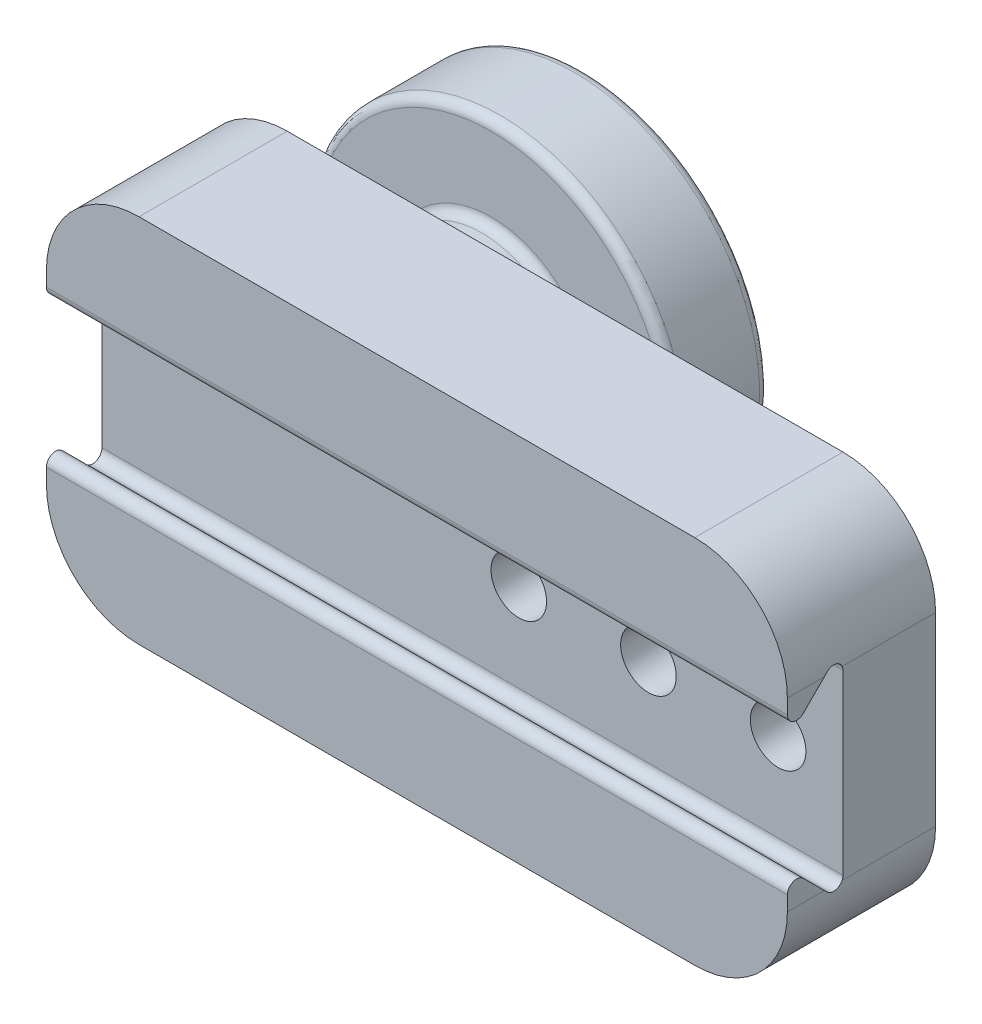
ISO-10303-21;
HEADER;
FILE_DESCRIPTION(('STEP AP214'),'2;1');
FILE_NAME('part.step','',(''),(''),'','','');
FILE_SCHEMA(('AUTOMOTIVE_DESIGN { 1 0 10303 214 1 1 1 1 }'));
ENDSEC;
DATA;
#1=APPLICATION_CONTEXT('core data for automotive mechanical design processes');
#2=APPLICATION_PROTOCOL_DEFINITION('international standard','automotive_design',2000,#1);
#3=PRODUCT_CONTEXT('',#1,'mechanical');
#4=PRODUCT('Part','Part','',(#3));
#5=PRODUCT_RELATED_PRODUCT_CATEGORY('part','',(#4));
#6=PRODUCT_DEFINITION_FORMATION('','',#4);
#7=PRODUCT_DEFINITION_CONTEXT('part definition',#1,'design');
#8=PRODUCT_DEFINITION('design','',#6,#7);
#9=PRODUCT_DEFINITION_SHAPE('','',#8);
#10=(LENGTH_UNIT() NAMED_UNIT(*) SI_UNIT(.MILLI.,.METRE.));
#11=(NAMED_UNIT(*) PLANE_ANGLE_UNIT() SI_UNIT($,.RADIAN.));
#12=(NAMED_UNIT(*) SI_UNIT($,.STERADIAN.) SOLID_ANGLE_UNIT());
#13=UNCERTAINTY_MEASURE_WITH_UNIT(LENGTH_MEASURE(1.E-05),#10,'distance_accuracy_value','');
#14=(GEOMETRIC_REPRESENTATION_CONTEXT(3) GLOBAL_UNCERTAINTY_ASSIGNED_CONTEXT((#13)) GLOBAL_UNIT_ASSIGNED_CONTEXT((#10,
#11,#12)) REPRESENTATION_CONTEXT('',''));
#15=CARTESIAN_POINT('',(0.,0.,0.));
#16=DIRECTION('',(0.,0.,1.));
#17=DIRECTION('',(1.,0.,0.));
#18=AXIS2_PLACEMENT_3D('',#15,#16,#17);
#19=CARTESIAN_POINT('',(-10.,10.,19.));
#20=DIRECTION('',(1.,0.,0.));
#21=DIRECTION('',(0.,1.,0.));
#22=AXIS2_PLACEMENT_3D('',#19,#20,#21);
#23=PLANE('',#22);
#24=DIRECTION('',(0.,-1.,0.));
#25=VECTOR('',#24,1.);
#26=CARTESIAN_POINT('',(-10.,10.,11.));
#27=LINE('',#26,#25);
#28=CARTESIAN_POINT('',(-10.,5.,11.));
#29=VERTEX_POINT('',#28);
#30=CARTESIAN_POINT('',(-10.,-5.,11.));
#31=VERTEX_POINT('',#30);
#32=EDGE_CURVE('E424',#29,#31,#27,.T.);
#33=ORIENTED_EDGE('',*,*,#32,.T.);
#34=DIRECTION('',(0.,0.,-1.));
#35=VECTOR('',#34,1.);
#36=CARTESIAN_POINT('',(-10.,-5.,19.));
#37=LINE('',#36,#35);
#38=CARTESIAN_POINT('',(-10.,-5.,16.0449101394378));
#39=VERTEX_POINT('',#38);
#40=EDGE_CURVE('E384',#31,#39,#37,.F.);
#41=ORIENTED_EDGE('',*,*,#40,.T.);
#42=CARTESIAN_POINT('',(-10.,-4.79289321881345,16.5));
#43=DIRECTION('',(1.,0.,0.));
#44=DIRECTION('',(0.,1.,0.));
#45=AXIS2_PLACEMENT_3D('',#42,#43,#44);
#46=CIRCLE('',#45,0.5);
#47=CARTESIAN_POINT('',(-10.,-4.79289321881345,16.));
#48=VERTEX_POINT('',#47);
#49=EDGE_CURVE('E230',#39,#48,#46,.T.);
#50=ORIENTED_EDGE('',*,*,#49,.T.);
#51=DIRECTION('',(0.,1.,0.));
#52=VECTOR('',#51,1.);
#53=CARTESIAN_POINT('',(-10.,6.,16.));
#54=LINE('',#53,#52);
#55=CARTESIAN_POINT('',(-10.,4.79289321881345,16.));
#56=VERTEX_POINT('',#55);
#57=EDGE_CURVE('E374',#48,#56,#54,.T.);
#58=ORIENTED_EDGE('',*,*,#57,.T.);
#59=CARTESIAN_POINT('',(-10.,4.79289321881345,16.5));
#60=DIRECTION('',(1.,0.,0.));
#61=DIRECTION('',(0.,1.,0.));
#62=AXIS2_PLACEMENT_3D('',#59,#60,#61);
#63=CIRCLE('',#62,0.5);
#64=CARTESIAN_POINT('',(-10.,5.,16.0449101394378));
#65=VERTEX_POINT('',#64);
#66=EDGE_CURVE('E237',#56,#65,#63,.T.);
#67=ORIENTED_EDGE('',*,*,#66,.T.);
#68=DIRECTION('',(0.,0.,-1.));
#69=VECTOR('',#68,1.);
#70=CARTESIAN_POINT('',(-10.,5.,19.));
#71=LINE('',#70,#69);
#72=EDGE_CURVE('E392',#65,#29,#71,.T.);
#73=ORIENTED_EDGE('',*,*,#72,.T.);
#74=EDGE_LOOP('',(#33,#41,#50,#58,#67,#73));
#75=FACE_BOUND('',#74,.T.);
#76=ADVANCED_FACE('F40',(#75),#23,.F.);
#77=DIRECTION('',(0.,-1.,0.));
#78=VECTOR('',#77,1.);
#79=CARTESIAN_POINT('',(-10.,10.,19.));
#80=LINE('',#79,#78);
#81=CARTESIAN_POINT('',(-10.,5.,19.));
#82=VERTEX_POINT('',#81);
#83=CARTESIAN_POINT('',(-10.,4.20710678118655,19.));
#84=VERTEX_POINT('',#83);
#85=EDGE_CURVE('E431',#82,#84,#80,.T.);
#86=ORIENTED_EDGE('',*,*,#85,.F.);
#87=DIRECTION('',(0.,0.,-1.));
#88=VECTOR('',#87,1.);
#89=CARTESIAN_POINT('',(-10.,5.,19.));
#90=LINE('',#89,#88);
#91=CARTESIAN_POINT('',(-10.,5.,17.));
#92=VERTEX_POINT('',#91);
#93=EDGE_CURVE('E385',#82,#92,#90,.T.);
#94=ORIENTED_EDGE('',*,*,#93,.T.);
#95=DIRECTION('',(0.,-0.707106781186548,0.707106781186547));
#96=VECTOR('',#95,1.);
#97=CARTESIAN_POINT('',(-10.,3.,19.));
#98=LINE('',#97,#96);
#99=CARTESIAN_POINT('',(-10.,3.85355339059327,18.1464466094067));
#100=VERTEX_POINT('',#99);
#101=EDGE_CURVE('E590',#92,#100,#98,.T.);
#102=ORIENTED_EDGE('',*,*,#101,.T.);
#103=CARTESIAN_POINT('',(-10.,4.20710678118655,18.5));
#104=DIRECTION('',(1.,0.,0.));
#105=DIRECTION('',(0.,1.,0.));
#106=AXIS2_PLACEMENT_3D('',#103,#104,#105);
#107=CIRCLE('',#106,0.5);
#108=EDGE_CURVE('E471',#100,#84,#107,.F.);
#109=ORIENTED_EDGE('',*,*,#108,.T.);
#110=EDGE_LOOP('',(#86,#94,#102,#109));
#111=FACE_BOUND('',#110,.T.);
#112=ADVANCED_FACE('F343',(#111),#23,.F.);
#113=CARTESIAN_POINT('',(30.,-10.,19.));
#114=DIRECTION('',(-1.,0.,0.));
#115=DIRECTION('',(0.,0.,1.));
#116=AXIS2_PLACEMENT_3D('',#113,#114,#115);
#117=PLANE('',#116);
#118=DIRECTION('',(0.,1.,0.));
#119=VECTOR('',#118,1.);
#120=CARTESIAN_POINT('',(30.,-10.,19.));
#121=LINE('',#120,#119);
#122=CARTESIAN_POINT('',(30.,-5.,19.));
#123=VERTEX_POINT('',#122);
#124=CARTESIAN_POINT('',(30.,-4.20710678118654,19.));
#125=VERTEX_POINT('',#124);
#126=EDGE_CURVE('E417',#123,#125,#121,.T.);
#127=ORIENTED_EDGE('',*,*,#126,.F.);
#128=DIRECTION('',(0.,0.,-1.));
#129=VECTOR('',#128,1.);
#130=CARTESIAN_POINT('',(30.,-5.,19.));
#131=LINE('',#130,#129);
#132=CARTESIAN_POINT('',(30.,-5.,17.));
#133=VERTEX_POINT('',#132);
#134=EDGE_CURVE('E201',#123,#133,#131,.T.);
#135=ORIENTED_EDGE('',*,*,#134,.T.);
#136=DIRECTION('',(0.,-0.707106781186548,-0.707106781186547));
#137=VECTOR('',#136,1.);
#138=CARTESIAN_POINT('',(30.,-6.5,15.5));
#139=LINE('',#138,#137);
#140=CARTESIAN_POINT('',(30.,-3.85355339059327,18.1464466094067));
#141=VERTEX_POINT('',#140);
#142=EDGE_CURVE('E184',#141,#133,#139,.T.);
#143=ORIENTED_EDGE('',*,*,#142,.F.);
#144=CARTESIAN_POINT('',(30.,-4.20710678118654,18.5));
#145=DIRECTION('',(-1.,0.,0.));
#146=DIRECTION('',(0.,0.,1.));
#147=AXIS2_PLACEMENT_3D('',#144,#145,#146);
#148=CIRCLE('',#147,0.5);
#149=EDGE_CURVE('E198',#141,#125,#148,.F.);
#150=ORIENTED_EDGE('',*,*,#149,.T.);
#151=EDGE_LOOP('',(#127,#135,#143,#150));
#152=FACE_BOUND('',#151,.T.);
#153=ADVANCED_FACE('F197',(#152),#117,.F.);
#154=CARTESIAN_POINT('',(30.,-4.79289321881345,16.5));
#155=DIRECTION('',(-1.,0.,0.));
#156=DIRECTION('',(0.,0.,1.));
#157=AXIS2_PLACEMENT_3D('',#154,#155,#156);
#158=CIRCLE('',#157,0.5);
#159=CARTESIAN_POINT('',(30.,-4.79289321881345,16.));
#160=VERTEX_POINT('',#159);
#161=CARTESIAN_POINT('',(30.,-5.,16.0449101394378));
#162=VERTEX_POINT('',#161);
#163=EDGE_CURVE('E233',#160,#162,#158,.T.);
#164=ORIENTED_EDGE('',*,*,#163,.T.);
#165=DIRECTION('',(0.,0.,-1.));
#166=VECTOR('',#165,1.);
#167=CARTESIAN_POINT('',(30.,-5.,19.));
#168=LINE('',#167,#166);
#169=CARTESIAN_POINT('',(30.,-5.,11.));
#170=VERTEX_POINT('',#169);
#171=EDGE_CURVE('E250',#162,#170,#168,.T.);
#172=ORIENTED_EDGE('',*,*,#171,.T.);
#173=DIRECTION('',(0.,1.,0.));
#174=VECTOR('',#173,1.);
#175=CARTESIAN_POINT('',(30.,-10.,11.));
#176=LINE('',#175,#174);
#177=CARTESIAN_POINT('',(30.,5.,11.));
#178=VERTEX_POINT('',#177);
#179=EDGE_CURVE('E439',#170,#178,#176,.T.);
#180=ORIENTED_EDGE('',*,*,#179,.T.);
#181=DIRECTION('',(0.,0.,-1.));
#182=VECTOR('',#181,1.);
#183=CARTESIAN_POINT('',(30.,5.,19.));
#184=LINE('',#183,#182);
#185=CARTESIAN_POINT('',(30.,5.,16.0449101394378));
#186=VERTEX_POINT('',#185);
#187=EDGE_CURVE('E247',#178,#186,#184,.F.);
#188=ORIENTED_EDGE('',*,*,#187,.T.);
#189=CARTESIAN_POINT('',(30.,4.79289321881345,16.5));
#190=DIRECTION('',(-1.,0.,0.));
#191=DIRECTION('',(0.,0.,1.));
#192=AXIS2_PLACEMENT_3D('',#189,#190,#191);
#193=CIRCLE('',#192,0.5);
#194=CARTESIAN_POINT('',(30.,4.79289321881345,16.));
#195=VERTEX_POINT('',#194);
#196=EDGE_CURVE('E241',#186,#195,#193,.T.);
#197=ORIENTED_EDGE('',*,*,#196,.T.);
#198=DIRECTION('',(0.,1.,0.));
#199=VECTOR('',#198,1.);
#200=CARTESIAN_POINT('',(30.,-10.,16.));
#201=LINE('',#200,#199);
#202=EDGE_CURVE('E203',#160,#195,#201,.T.);
#203=ORIENTED_EDGE('',*,*,#202,.F.);
#204=EDGE_LOOP('',(#164,#172,#180,#188,#197,#203));
#205=FACE_BOUND('',#204,.T.);
#206=ADVANCED_FACE('F368',(#205),#117,.F.);
#207=CARTESIAN_POINT('',(12.5,0.,32.));
#208=DIRECTION('',(0.,0.,-1.));
#209=DIRECTION('',(-1.,0.,0.));
#210=AXIS2_PLACEMENT_3D('',#207,#208,#209);
#211=CYLINDRICAL_SURFACE('',#210,1.5);
#212=CARTESIAN_POINT('',(12.5,0.,16.));
#213=DIRECTION('',(0.,0.,1.));
#214=DIRECTION('',(1.,0.,0.));
#215=AXIS2_PLACEMENT_3D('',#212,#213,#214);
#216=CIRCLE('',#215,1.5);
#217=CARTESIAN_POINT('',(14.,0.,16.));
#218=VERTEX_POINT('',#217);
#219=EDGE_CURVE('E434',#218,#218,#216,.F.);
#220=ORIENTED_EDGE('',*,*,#219,.F.);
#221=EDGE_LOOP('',(#220));
#222=FACE_BOUND('',#221,.T.);
#223=CARTESIAN_POINT('',(12.5,0.,11.));
#224=DIRECTION('',(0.,0.,1.));
#225=DIRECTION('',(1.,0.,0.));
#226=AXIS2_PLACEMENT_3D('',#223,#224,#225);
#227=CIRCLE('',#226,1.5);
#228=CARTESIAN_POINT('',(14.,0.,11.));
#229=VERTEX_POINT('',#228);
#230=EDGE_CURVE('E191',#229,#229,#227,.F.);
#231=ORIENTED_EDGE('',*,*,#230,.T.);
#232=EDGE_LOOP('',(#231));
#233=FACE_BOUND('',#232,.T.);
#234=ADVANCED_FACE('F287',(#222,#233),#211,.F.);
#235=DIRECTION('',(0.,-0.707106781186548,0.707106781186547));
#236=VECTOR('',#235,1.);
#237=CARTESIAN_POINT('',(30.,-3.5,25.5));
#238=LINE('',#237,#236);
#239=CARTESIAN_POINT('',(30.,5.,17.));
#240=VERTEX_POINT('',#239);
#241=CARTESIAN_POINT('',(30.,3.85355339059328,18.1464466094067));
#242=VERTEX_POINT('',#241);
#243=EDGE_CURVE('E204',#240,#242,#238,.T.);
#244=ORIENTED_EDGE('',*,*,#243,.F.);
#245=DIRECTION('',(0.,0.,-1.));
#246=VECTOR('',#245,1.);
#247=CARTESIAN_POINT('',(30.,5.,19.));
#248=LINE('',#247,#246);
#249=CARTESIAN_POINT('',(30.,5.,19.));
#250=VERTEX_POINT('',#249);
#251=EDGE_CURVE('E244',#240,#250,#248,.F.);
#252=ORIENTED_EDGE('',*,*,#251,.T.);
#253=CARTESIAN_POINT('',(30.,4.20710678118655,19.));
#254=VERTEX_POINT('',#253);
#255=EDGE_CURVE('E414',#254,#250,#121,.T.);
#256=ORIENTED_EDGE('',*,*,#255,.F.);
#257=CARTESIAN_POINT('',(30.,4.20710678118655,18.5));
#258=DIRECTION('',(-1.,0.,0.));
#259=DIRECTION('',(0.,0.,1.));
#260=AXIS2_PLACEMENT_3D('',#257,#258,#259);
#261=CIRCLE('',#260,0.5);
#262=EDGE_CURVE('E211',#254,#242,#261,.F.);
#263=ORIENTED_EDGE('',*,*,#262,.T.);
#264=EDGE_LOOP('',(#244,#252,#256,#263));
#265=FACE_BOUND('',#264,.T.);
#266=ADVANCED_FACE('F357',(#265),#117,.F.);
#267=DIRECTION('',(0.,-0.707106781186548,-0.707106781186547));
#268=VECTOR('',#267,1.);
#269=CARTESIAN_POINT('',(-10.,-6.,16.));
#270=LINE('',#269,#268);
#271=CARTESIAN_POINT('',(-10.,-3.85355339059327,18.1464466094067));
#272=VERTEX_POINT('',#271);
#273=CARTESIAN_POINT('',(-10.,-5.,17.));
#274=VERTEX_POINT('',#273);
#275=EDGE_CURVE('E186',#272,#274,#270,.T.);
#276=ORIENTED_EDGE('',*,*,#275,.T.);
#277=DIRECTION('',(0.,0.,-1.));
#278=VECTOR('',#277,1.);
#279=CARTESIAN_POINT('',(-10.,-5.,19.));
#280=LINE('',#279,#278);
#281=CARTESIAN_POINT('',(-10.,-5.,19.));
#282=VERTEX_POINT('',#281);
#283=EDGE_CURVE('E371',#274,#282,#280,.F.);
#284=ORIENTED_EDGE('',*,*,#283,.T.);
#285=CARTESIAN_POINT('',(-10.,-4.20710678118654,19.));
#286=VERTEX_POINT('',#285);
#287=EDGE_CURVE('E430',#286,#282,#80,.T.);
#288=ORIENTED_EDGE('',*,*,#287,.F.);
#289=CARTESIAN_POINT('',(-10.,-4.20710678118654,18.5));
#290=DIRECTION('',(1.,0.,0.));
#291=DIRECTION('',(0.,1.,0.));
#292=AXIS2_PLACEMENT_3D('',#289,#290,#291);
#293=CIRCLE('',#292,0.5);
#294=EDGE_CURVE('E219',#286,#272,#293,.F.);
#295=ORIENTED_EDGE('',*,*,#294,.T.);
#296=EDGE_LOOP('',(#276,#284,#288,#295));
#297=FACE_BOUND('',#296,.T.);
#298=ADVANCED_FACE('F346',(#297),#23,.F.);
#299=CARTESIAN_POINT('',(0.,0.,19.));
#300=DIRECTION('',(0.,0.,1.));
#301=DIRECTION('',(1.,0.,0.));
#302=AXIS2_PLACEMENT_3D('',#299,#300,#301);
#303=PLANE('',#302);
#304=DIRECTION('',(1.,0.,0.));
#305=VECTOR('',#304,1.);
#306=CARTESIAN_POINT('',(-10.,-10.,19.));
#307=LINE('',#306,#305);
#308=CARTESIAN_POINT('',(-5.,-10.,19.));
#309=VERTEX_POINT('',#308);
#310=CARTESIAN_POINT('',(25.,-10.,19.));
#311=VERTEX_POINT('',#310);
#312=EDGE_CURVE('E418',#309,#311,#307,.T.);
#313=ORIENTED_EDGE('',*,*,#312,.T.);
#314=CARTESIAN_POINT('',(25.,-5.,19.));
#315=DIRECTION('',(0.,0.,1.));
#316=DIRECTION('',(1.,0.,0.));
#317=AXIS2_PLACEMENT_3D('',#314,#315,#316);
#318=CIRCLE('',#317,5.);
#319=EDGE_CURVE('E478',#311,#123,#318,.T.);
#320=ORIENTED_EDGE('',*,*,#319,.T.);
#321=ORIENTED_EDGE('',*,*,#126,.T.);
#322=DIRECTION('',(-1.,0.,0.));
#323=VECTOR('',#322,1.);
#324=CARTESIAN_POINT('',(0.,-4.20710678118654,19.));
#325=LINE('',#324,#323);
#326=EDGE_CURVE('E208',#125,#286,#325,.T.);
#327=ORIENTED_EDGE('',*,*,#326,.T.);
#328=ORIENTED_EDGE('',*,*,#287,.T.);
#329=CARTESIAN_POINT('',(-5.,-5.,19.));
#330=DIRECTION('',(0.,0.,1.));
#331=DIRECTION('',(1.,0.,0.));
#332=AXIS2_PLACEMENT_3D('',#329,#330,#331);
#333=CIRCLE('',#332,5.);
#334=EDGE_CURVE('E382',#282,#309,#333,.T.);
#335=ORIENTED_EDGE('',*,*,#334,.T.);
#336=EDGE_LOOP('',(#313,#320,#321,#327,#328,#335));
#337=FACE_BOUND('',#336,.T.);
#338=ADVANCED_FACE('F356',(#337),#303,.T.);
#339=DIRECTION('',(-1.,0.,0.));
#340=VECTOR('',#339,1.);
#341=CARTESIAN_POINT('',(30.,10.,19.));
#342=LINE('',#341,#340);
#343=CARTESIAN_POINT('',(25.,10.,19.));
#344=VERTEX_POINT('',#343);
#345=CARTESIAN_POINT('',(-5.,10.,19.));
#346=VERTEX_POINT('',#345);
#347=EDGE_CURVE('E422',#344,#346,#342,.T.);
#348=ORIENTED_EDGE('',*,*,#347,.T.);
#349=CARTESIAN_POINT('',(-5.,5.,19.));
#350=DIRECTION('',(0.,0.,1.));
#351=DIRECTION('',(1.,0.,0.));
#352=AXIS2_PLACEMENT_3D('',#349,#350,#351);
#353=CIRCLE('',#352,5.);
#354=EDGE_CURVE('E533',#346,#82,#353,.T.);
#355=ORIENTED_EDGE('',*,*,#354,.T.);
#356=ORIENTED_EDGE('',*,*,#85,.T.);
#357=DIRECTION('',(1.,0.,0.));
#358=VECTOR('',#357,1.);
#359=CARTESIAN_POINT('',(0.,4.20710678118655,19.));
#360=LINE('',#359,#358);
#361=EDGE_CURVE('E226',#84,#254,#360,.T.);
#362=ORIENTED_EDGE('',*,*,#361,.T.);
#363=ORIENTED_EDGE('',*,*,#255,.T.);
#364=CARTESIAN_POINT('',(25.,5.,19.));
#365=DIRECTION('',(0.,0.,1.));
#366=DIRECTION('',(1.,0.,0.));
#367=AXIS2_PLACEMENT_3D('',#364,#365,#366);
#368=CIRCLE('',#367,5.);
#369=EDGE_CURVE('E63',#250,#344,#368,.T.);
#370=ORIENTED_EDGE('',*,*,#369,.T.);
#371=EDGE_LOOP('',(#348,#355,#356,#362,#363,#370));
#372=FACE_BOUND('',#371,.T.);
#373=ADVANCED_FACE('F363',(#372),#303,.T.);
#374=CARTESIAN_POINT('',(0.,0.,5.));
#375=DIRECTION('',(0.,0.,-1.));
#376=DIRECTION('',(-1.,0.,0.));
#377=AXIS2_PLACEMENT_3D('',#374,#375,#376);
#378=CYLINDRICAL_SURFACE('',#377,10.);
#379=CARTESIAN_POINT('',(0.,0.,0.5));
#380=DIRECTION('',(0.,0.,-1.));
#381=DIRECTION('',(-1.,0.,0.));
#382=AXIS2_PLACEMENT_3D('',#379,#380,#381);
#383=CIRCLE('',#382,10.);
#384=CARTESIAN_POINT('',(-10.,0.,0.5));
#385=VERTEX_POINT('',#384);
#386=EDGE_CURVE('E542',#385,#385,#383,.F.);
#387=ORIENTED_EDGE('',*,*,#386,.T.);
#388=EDGE_LOOP('',(#387));
#389=FACE_BOUND('',#388,.T.);
#390=CARTESIAN_POINT('',(0.,0.,4.5));
#391=DIRECTION('',(0.,0.,-1.));
#392=DIRECTION('',(-1.,0.,0.));
#393=AXIS2_PLACEMENT_3D('',#390,#391,#392);
#394=CIRCLE('',#393,10.);
#395=CARTESIAN_POINT('',(-10.,0.,4.5));
#396=VERTEX_POINT('',#395);
#397=EDGE_CURVE('E538',#396,#396,#394,.T.);
#398=ORIENTED_EDGE('',*,*,#397,.T.);
#399=EDGE_LOOP('',(#398));
#400=FACE_BOUND('',#399,.T.);
#401=ADVANCED_FACE('F765',(#389,#400),#378,.T.);
#402=CARTESIAN_POINT('',(0.,0.,5.));
#403=DIRECTION('',(0.,0.,-1.));
#404=DIRECTION('',(-1.,0.,0.));
#405=AXIS2_PLACEMENT_3D('',#402,#403,#404);
#406=PLANE('',#405);
#407=CARTESIAN_POINT('',(0.,0.,5.));
#408=DIRECTION('',(0.,0.,-1.));
#409=DIRECTION('',(-1.,0.,0.));
#410=AXIS2_PLACEMENT_3D('',#407,#408,#409);
#411=CIRCLE('',#410,9.5);
#412=CARTESIAN_POINT('',(-9.5,0.,5.));
#413=VERTEX_POINT('',#412);
#414=EDGE_CURVE('E554',#413,#413,#411,.F.);
#415=ORIENTED_EDGE('',*,*,#414,.T.);
#416=EDGE_LOOP('',(#415));
#417=FACE_BOUND('',#416,.T.);
#418=CARTESIAN_POINT('',(0.,0.,5.));
#419=DIRECTION('',(0.,0.,-1.));
#420=DIRECTION('',(-1.,0.,0.));
#421=AXIS2_PLACEMENT_3D('',#418,#419,#420);
#422=CIRCLE('',#421,5.5);
#423=CARTESIAN_POINT('',(-5.5,0.,5.));
#424=VERTEX_POINT('',#423);
#425=EDGE_CURVE('E550',#424,#424,#422,.T.);
#426=ORIENTED_EDGE('',*,*,#425,.T.);
#427=EDGE_LOOP('',(#426));
#428=FACE_BOUND('',#427,.T.);
#429=ADVANCED_FACE('F801',(#417,#428),#406,.F.);
#430=CARTESIAN_POINT('',(0.,0.,0.));
#431=DIRECTION('',(0.,0.,-1.));
#432=DIRECTION('',(-1.,0.,0.));
#433=AXIS2_PLACEMENT_3D('',#430,#431,#432);
#434=PLANE('',#433);
#435=CARTESIAN_POINT('',(0.,0.,0.));
#436=DIRECTION('',(0.,0.,-1.));
#437=DIRECTION('',(-1.,0.,0.));
#438=AXIS2_PLACEMENT_3D('',#435,#436,#437);
#439=CIRCLE('',#438,9.5);
#440=CARTESIAN_POINT('',(-9.5,0.,0.));
#441=VERTEX_POINT('',#440);
#442=EDGE_CURVE('E546',#441,#441,#439,.T.);
#443=ORIENTED_EDGE('',*,*,#442,.T.);
#444=EDGE_LOOP('',(#443));
#445=FACE_BOUND('',#444,.T.);
#446=ADVANCED_FACE('F568',(#445),#434,.T.);
#447=CARTESIAN_POINT('',(0.,0.,11.));
#448=DIRECTION('',(0.,0.,-1.));
#449=DIRECTION('',(-1.,0.,0.));
#450=AXIS2_PLACEMENT_3D('',#447,#448,#449);
#451=CYLINDRICAL_SURFACE('',#450,5.);
#452=CARTESIAN_POINT('',(0.,0.,5.5));
#453=DIRECTION('',(0.,0.,-1.));
#454=DIRECTION('',(-1.,0.,0.));
#455=AXIS2_PLACEMENT_3D('',#452,#453,#454);
#456=CIRCLE('',#455,5.);
#457=CARTESIAN_POINT('',(-5.,0.,5.5));
#458=VERTEX_POINT('',#457);
#459=EDGE_CURVE('E49',#458,#458,#456,.F.);
#460=ORIENTED_EDGE('',*,*,#459,.T.);
#461=EDGE_LOOP('',(#460));
#462=FACE_BOUND('',#461,.T.);
#463=CARTESIAN_POINT('',(0.,0.,10.5));
#464=DIRECTION('',(0.,0.,1.));
#465=DIRECTION('',(1.,0.,0.));
#466=AXIS2_PLACEMENT_3D('',#463,#464,#465);
#467=CIRCLE('',#466,5.);
#468=CARTESIAN_POINT('',(5.,0.,10.5));
#469=VERTEX_POINT('',#468);
#470=EDGE_CURVE('E558',#469,#469,#467,.F.);
#471=ORIENTED_EDGE('',*,*,#470,.T.);
#472=EDGE_LOOP('',(#471));
#473=FACE_BOUND('',#472,.T.);
#474=ADVANCED_FACE('F565',(#462,#473),#451,.T.);
#475=CARTESIAN_POINT('',(10.,-10.,19.));
#476=DIRECTION('',(0.,1.,0.));
#477=DIRECTION('',(0.,0.,1.));
#478=AXIS2_PLACEMENT_3D('',#475,#476,#477);
#479=PLANE('',#478);
#480=DIRECTION('',(1.,0.,0.));
#481=VECTOR('',#480,1.);
#482=CARTESIAN_POINT('',(10.,-10.,11.));
#483=LINE('',#482,#481);
#484=CARTESIAN_POINT('',(-5.,-10.,11.));
#485=VERTEX_POINT('',#484);
#486=CARTESIAN_POINT('',(25.,-10.,11.));
#487=VERTEX_POINT('',#486);
#488=EDGE_CURVE('E435',#485,#487,#483,.T.);
#489=ORIENTED_EDGE('',*,*,#488,.T.);
#490=DIRECTION('',(0.,0.,-1.));
#491=VECTOR('',#490,1.);
#492=CARTESIAN_POINT('',(25.,-10.,19.));
#493=LINE('',#492,#491);
#494=EDGE_CURVE('E517',#487,#311,#493,.F.);
#495=ORIENTED_EDGE('',*,*,#494,.T.);
#496=ORIENTED_EDGE('',*,*,#312,.F.);
#497=DIRECTION('',(0.,0.,-1.));
#498=VECTOR('',#497,1.);
#499=CARTESIAN_POINT('',(-5.,-10.,19.));
#500=LINE('',#499,#498);
#501=EDGE_CURVE('E514',#309,#485,#500,.T.);
#502=ORIENTED_EDGE('',*,*,#501,.T.);
#503=EDGE_LOOP('',(#489,#495,#496,#502));
#504=FACE_BOUND('',#503,.T.);
#505=ADVANCED_FACE('F525',(#504),#479,.F.);
#506=CARTESIAN_POINT('',(-10.,10.,19.));
#507=DIRECTION('',(0.,-1.,0.));
#508=DIRECTION('',(0.,0.,-1.));
#509=AXIS2_PLACEMENT_3D('',#506,#507,#508);
#510=PLANE('',#509);
#511=DIRECTION('',(-1.,0.,0.));
#512=VECTOR('',#511,1.);
#513=CARTESIAN_POINT('',(-10.,10.,11.));
#514=LINE('',#513,#512);
#515=CARTESIAN_POINT('',(25.,10.,11.));
#516=VERTEX_POINT('',#515);
#517=CARTESIAN_POINT('',(-5.,10.,11.));
#518=VERTEX_POINT('',#517);
#519=EDGE_CURVE('E443',#516,#518,#514,.T.);
#520=ORIENTED_EDGE('',*,*,#519,.T.);
#521=DIRECTION('',(0.,0.,-1.));
#522=VECTOR('',#521,1.);
#523=CARTESIAN_POINT('',(-5.,10.,19.));
#524=LINE('',#523,#522);
#525=EDGE_CURVE('E56',#518,#346,#524,.F.);
#526=ORIENTED_EDGE('',*,*,#525,.T.);
#527=ORIENTED_EDGE('',*,*,#347,.F.);
#528=DIRECTION('',(0.,0.,-1.));
#529=VECTOR('',#528,1.);
#530=CARTESIAN_POINT('',(25.,10.,19.));
#531=LINE('',#530,#529);
#532=EDGE_CURVE('E315',#344,#516,#531,.T.);
#533=ORIENTED_EDGE('',*,*,#532,.T.);
#534=EDGE_LOOP('',(#520,#526,#527,#533));
#535=FACE_BOUND('',#534,.T.);
#536=ADVANCED_FACE('F529',(#535),#510,.F.);
#537=CARTESIAN_POINT('',(0.,0.,11.));
#538=DIRECTION('',(0.,0.,1.));
#539=DIRECTION('',(1.,0.,0.));
#540=AXIS2_PLACEMENT_3D('',#537,#538,#539);
#541=PLANE('',#540);
#542=CARTESIAN_POINT('',(0.,0.,11.));
#543=DIRECTION('',(0.,0.,1.));
#544=DIRECTION('',(1.,0.,0.));
#545=AXIS2_PLACEMENT_3D('',#542,#543,#544);
#546=CIRCLE('',#545,5.5);
#547=CARTESIAN_POINT('',(5.5,0.,11.));
#548=VERTEX_POINT('',#547);
#549=EDGE_CURVE('E11',#548,#548,#546,.T.);
#550=ORIENTED_EDGE('',*,*,#549,.T.);
#551=EDGE_LOOP('',(#550));
#552=FACE_BOUND('',#551,.T.);
#553=CARTESIAN_POINT('',(19.5,0.,11.));
#554=DIRECTION('',(0.,0.,1.));
#555=DIRECTION('',(1.,0.,0.));
#556=AXIS2_PLACEMENT_3D('',#553,#554,#555);
#557=CIRCLE('',#556,1.5);
#558=CARTESIAN_POINT('',(21.,0.,11.));
#559=VERTEX_POINT('',#558);
#560=EDGE_CURVE('E452',#559,#559,#557,.F.);
#561=ORIENTED_EDGE('',*,*,#560,.F.);
#562=EDGE_LOOP('',(#561));
#563=FACE_BOUND('',#562,.T.);
#564=CARTESIAN_POINT('',(26.5,0.,11.));
#565=DIRECTION('',(0.,0.,1.));
#566=DIRECTION('',(1.,0.,0.));
#567=AXIS2_PLACEMENT_3D('',#564,#565,#566);
#568=CIRCLE('',#567,1.5);
#569=CARTESIAN_POINT('',(28.,0.,11.));
#570=VERTEX_POINT('',#569);
#571=EDGE_CURVE('E375',#570,#570,#568,.F.);
#572=ORIENTED_EDGE('',*,*,#571,.F.);
#573=EDGE_LOOP('',(#572));
#574=FACE_BOUND('',#573,.T.);
#575=ORIENTED_EDGE('',*,*,#179,.F.);
#576=CARTESIAN_POINT('',(25.,-5.,11.));
#577=DIRECTION('',(0.,0.,1.));
#578=DIRECTION('',(1.,0.,0.));
#579=AXIS2_PLACEMENT_3D('',#576,#577,#578);
#580=CIRCLE('',#579,5.);
#581=EDGE_CURVE('E509',#170,#487,#580,.F.);
#582=ORIENTED_EDGE('',*,*,#581,.T.);
#583=ORIENTED_EDGE('',*,*,#488,.F.);
#584=CARTESIAN_POINT('',(-5.,-5.,11.));
#585=DIRECTION('',(0.,0.,1.));
#586=DIRECTION('',(1.,0.,0.));
#587=AXIS2_PLACEMENT_3D('',#584,#585,#586);
#588=CIRCLE('',#587,5.);
#589=EDGE_CURVE('E489',#485,#31,#588,.F.);
#590=ORIENTED_EDGE('',*,*,#589,.T.);
#591=ORIENTED_EDGE('',*,*,#32,.F.);
#592=CARTESIAN_POINT('',(-5.,5.,11.));
#593=DIRECTION('',(0.,0.,1.));
#594=DIRECTION('',(1.,0.,0.));
#595=AXIS2_PLACEMENT_3D('',#592,#593,#594);
#596=CIRCLE('',#595,5.);
#597=EDGE_CURVE('E501',#29,#518,#596,.F.);
#598=ORIENTED_EDGE('',*,*,#597,.T.);
#599=ORIENTED_EDGE('',*,*,#519,.F.);
#600=CARTESIAN_POINT('',(25.,5.,11.));
#601=DIRECTION('',(0.,0.,1.));
#602=DIRECTION('',(1.,0.,0.));
#603=AXIS2_PLACEMENT_3D('',#600,#601,#602);
#604=CIRCLE('',#603,5.);
#605=EDGE_CURVE('E505',#516,#178,#604,.F.);
#606=ORIENTED_EDGE('',*,*,#605,.T.);
#607=EDGE_LOOP('',(#575,#582,#583,#590,#591,#598,#599,#606));
#608=FACE_BOUND('',#607,.T.);
#609=ORIENTED_EDGE('',*,*,#230,.F.);
#610=EDGE_LOOP('',(#609));
#611=FACE_BOUND('',#610,.T.);
#612=ADVANCED_FACE('F498',(#552,#563,#574,#608,#611),#541,.F.);
#613=CARTESIAN_POINT('',(32.,6.,16.));
#614=DIRECTION('',(0.,0.,1.));
#615=DIRECTION('',(1.,0.,0.));
#616=AXIS2_PLACEMENT_3D('',#613,#614,#615);
#617=PLANE('',#616);
#618=CARTESIAN_POINT('',(19.5,0.,16.));
#619=DIRECTION('',(0.,0.,1.));
#620=DIRECTION('',(1.,0.,0.));
#621=AXIS2_PLACEMENT_3D('',#618,#619,#620);
#622=CIRCLE('',#621,1.5);
#623=CARTESIAN_POINT('',(21.,0.,16.));
#624=VERTEX_POINT('',#623);
#625=EDGE_CURVE('E844',#624,#624,#622,.F.);
#626=ORIENTED_EDGE('',*,*,#625,.T.);
#627=EDGE_LOOP('',(#626));
#628=FACE_BOUND('',#627,.T.);
#629=CARTESIAN_POINT('',(26.5,0.,16.));
#630=DIRECTION('',(0.,0.,1.));
#631=DIRECTION('',(1.,0.,0.));
#632=AXIS2_PLACEMENT_3D('',#629,#630,#631);
#633=CIRCLE('',#632,1.5);
#634=CARTESIAN_POINT('',(28.,0.,16.));
#635=VERTEX_POINT('',#634);
#636=EDGE_CURVE('E448',#635,#635,#633,.F.);
#637=ORIENTED_EDGE('',*,*,#636,.T.);
#638=EDGE_LOOP('',(#637));
#639=FACE_BOUND('',#638,.T.);
#640=ORIENTED_EDGE('',*,*,#57,.F.);
#641=DIRECTION('',(-1.,0.,0.));
#642=VECTOR('',#641,1.);
#643=CARTESIAN_POINT('',(30.,-4.79289321881345,16.));
#644=LINE('',#643,#642);
#645=EDGE_CURVE('E466',#48,#160,#644,.F.);
#646=ORIENTED_EDGE('',*,*,#645,.T.);
#647=ORIENTED_EDGE('',*,*,#202,.T.);
#648=DIRECTION('',(-1.,0.,0.));
#649=VECTOR('',#648,1.);
#650=CARTESIAN_POINT('',(-10.,4.79289321881345,16.));
#651=LINE('',#650,#649);
#652=EDGE_CURVE('E462',#195,#56,#651,.T.);
#653=ORIENTED_EDGE('',*,*,#652,.T.);
#654=EDGE_LOOP('',(#640,#646,#647,#653));
#655=FACE_BOUND('',#654,.T.);
#656=ORIENTED_EDGE('',*,*,#219,.T.);
#657=EDGE_LOOP('',(#656));
#658=FACE_BOUND('',#657,.T.);
#659=ADVANCED_FACE('F576',(#628,#639,#655,#658),#617,.T.);
#660=CARTESIAN_POINT('',(32.,-6.,16.));
#661=DIRECTION('',(0.,0.707106781186547,-0.707106781186548));
#662=DIRECTION('',(0.,0.707106781186548,0.707106781186547));
#663=AXIS2_PLACEMENT_3D('',#660,#661,#662);
#664=PLANE('',#663);
#665=ORIENTED_EDGE('',*,*,#142,.T.);
#666=CARTESIAN_POINT('',(25.,-5.,17.));
#667=DIRECTION('',(0.,0.707106781186547,-0.707106781186548));
#668=DIRECTION('',(0.,-0.707106781186548,-0.707106781186547));
#669=AXIS2_PLACEMENT_3D('',#666,#667,#668);
#670=ELLIPSE('',#669,7.07106781186547,5.);
#671=CARTESIAN_POINT('',(29.9978548789049,-5.14644660940672,16.8535533905933));
#672=VERTEX_POINT('',#671);
#673=EDGE_CURVE('E258',#133,#672,#670,.T.);
#674=ORIENTED_EDGE('',*,*,#673,.T.);
#675=DIRECTION('',(-1.,0.,0.));
#676=VECTOR('',#675,1.);
#677=CARTESIAN_POINT('',(-10.,-5.14644660940672,16.8535533905933));
#678=LINE('',#677,#676);
#679=CARTESIAN_POINT('',(-9.99785487890488,-5.14644660940672,16.8535533905933));
#680=VERTEX_POINT('',#679);
#681=EDGE_CURVE('E190',#672,#680,#678,.T.);
#682=ORIENTED_EDGE('',*,*,#681,.T.);
#683=CARTESIAN_POINT('',(-5.,-5.,17.));
#684=DIRECTION('',(0.,0.707106781186547,-0.707106781186548));
#685=DIRECTION('',(0.,-0.707106781186548,-0.707106781186547));
#686=AXIS2_PLACEMENT_3D('',#683,#684,#685);
#687=ELLIPSE('',#686,7.07106781186547,5.);
#688=EDGE_CURVE('E255',#680,#274,#687,.T.);
#689=ORIENTED_EDGE('',*,*,#688,.T.);
#690=ORIENTED_EDGE('',*,*,#275,.F.);
#691=DIRECTION('',(-1.,0.,0.));
#692=VECTOR('',#691,1.);
#693=CARTESIAN_POINT('',(32.,-3.85355339059327,18.1464466094067));
#694=LINE('',#693,#692);
#695=EDGE_CURVE('E181',#272,#141,#694,.F.);
#696=ORIENTED_EDGE('',*,*,#695,.T.);
#697=EDGE_LOOP('',(#665,#674,#682,#689,#690,#696));
#698=FACE_BOUND('',#697,.T.);
#699=ADVANCED_FACE('F183',(#698),#664,.T.);
#700=CARTESIAN_POINT('',(32.,3.,19.));
#701=DIRECTION('',(0.,-0.707106781186547,-0.707106781186548));
#702=DIRECTION('',(0.,0.707106781186548,-0.707106781186547));
#703=AXIS2_PLACEMENT_3D('',#700,#701,#702);
#704=PLANE('',#703);
#705=ORIENTED_EDGE('',*,*,#101,.F.);
#706=CARTESIAN_POINT('',(-5.,5.,17.));
#707=DIRECTION('',(0.,-0.707106781186547,-0.707106781186548));
#708=DIRECTION('',(0.,0.707106781186548,-0.707106781186547));
#709=AXIS2_PLACEMENT_3D('',#706,#707,#708);
#710=ELLIPSE('',#709,7.07106781186547,5.);
#711=CARTESIAN_POINT('',(-9.99785487890488,5.14644660940673,16.8535533905933));
#712=VERTEX_POINT('',#711);
#713=EDGE_CURVE('E397',#92,#712,#710,.T.);
#714=ORIENTED_EDGE('',*,*,#713,.T.);
#715=DIRECTION('',(-1.,0.,0.));
#716=VECTOR('',#715,1.);
#717=CARTESIAN_POINT('',(30.,5.14644660940673,16.8535533905933));
#718=LINE('',#717,#716);
#719=CARTESIAN_POINT('',(29.9978548789049,5.14644660940673,16.8535533905933));
#720=VERTEX_POINT('',#719);
#721=EDGE_CURVE('E216',#712,#720,#718,.F.);
#722=ORIENTED_EDGE('',*,*,#721,.T.);
#723=CARTESIAN_POINT('',(25.,5.,17.));
#724=DIRECTION('',(0.,-0.707106781186547,-0.707106781186548));
#725=DIRECTION('',(0.,0.707106781186548,-0.707106781186547));
#726=AXIS2_PLACEMENT_3D('',#723,#724,#725);
#727=ELLIPSE('',#726,7.07106781186547,5.);
#728=EDGE_CURVE('E389',#720,#240,#727,.T.);
#729=ORIENTED_EDGE('',*,*,#728,.T.);
#730=ORIENTED_EDGE('',*,*,#243,.T.);
#731=DIRECTION('',(1.,0.,0.));
#732=VECTOR('',#731,1.);
#733=CARTESIAN_POINT('',(32.,3.85355339059328,18.1464466094067));
#734=LINE('',#733,#732);
#735=EDGE_CURVE('E210',#242,#100,#734,.F.);
#736=ORIENTED_EDGE('',*,*,#735,.T.);
#737=EDGE_LOOP('',(#705,#714,#722,#729,#730,#736));
#738=FACE_BOUND('',#737,.T.);
#739=ADVANCED_FACE('F409',(#738),#704,.T.);
#740=CARTESIAN_POINT('',(26.5,0.,32.));
#741=DIRECTION('',(0.,0.,-1.));
#742=DIRECTION('',(-1.,0.,0.));
#743=AXIS2_PLACEMENT_3D('',#740,#741,#742);
#744=CYLINDRICAL_SURFACE('',#743,1.5);
#745=ORIENTED_EDGE('',*,*,#636,.F.);
#746=EDGE_LOOP('',(#745));
#747=FACE_BOUND('',#746,.T.);
#748=ORIENTED_EDGE('',*,*,#571,.T.);
#749=EDGE_LOOP('',(#748));
#750=FACE_BOUND('',#749,.T.);
#751=ADVANCED_FACE('F706',(#747,#750),#744,.F.);
#752=CARTESIAN_POINT('',(19.5,0.,32.));
#753=DIRECTION('',(0.,0.,-1.));
#754=DIRECTION('',(-1.,0.,0.));
#755=AXIS2_PLACEMENT_3D('',#752,#753,#754);
#756=CYLINDRICAL_SURFACE('',#755,1.5);
#757=ORIENTED_EDGE('',*,*,#625,.F.);
#758=EDGE_LOOP('',(#757));
#759=FACE_BOUND('',#758,.T.);
#760=ORIENTED_EDGE('',*,*,#560,.T.);
#761=EDGE_LOOP('',(#760));
#762=FACE_BOUND('',#761,.T.);
#763=ADVANCED_FACE('F285',(#759,#762),#756,.F.);
#764=CARTESIAN_POINT('',(32.,-4.79289321881345,16.5));
#765=DIRECTION('',(1.,0.,0.));
#766=DIRECTION('',(0.,0.,-1.));
#767=AXIS2_PLACEMENT_3D('',#764,#765,#766);
#768=CYLINDRICAL_SURFACE('',#767,0.5);
#769=ORIENTED_EDGE('',*,*,#681,.F.);
#770=CARTESIAN_POINT('',(29.9978548789049,-5.14644660940672,16.8535533905933));
#771=CARTESIAN_POINT('',(29.9972699002105,-5.166352779612,16.8336804973206));
#772=CARTESIAN_POINT('',(29.9966192368007,-5.18454227632952,16.8121029856383));
#773=CARTESIAN_POINT('',(29.9953137506321,-5.21704852061166,16.7662249973141));
#774=CARTESIAN_POINT('',(29.9946589308167,-5.23136775081049,16.7419262804434));
#775=CARTESIAN_POINT('',(29.9934709797885,-5.25572658160098,16.6912527594211));
#776=CARTESIAN_POINT('',(29.9929379069039,-5.26576413285536,16.6648769682591));
#777=CARTESIAN_POINT('',(29.9920887067429,-5.28126743866931,16.6108181401868));
#778=CARTESIAN_POINT('',(29.9917725269747,-5.2867342994831,16.5831354213097));
#779=CARTESIAN_POINT('',(29.9914122895034,-5.2929388151013,16.5272696232771));
#780=CARTESIAN_POINT('',(29.9913679739386,-5.29368095130674,16.4990870436963));
#781=CARTESIAN_POINT('',(29.9915583630059,-5.29042670273497,16.4429927623489));
#782=CARTESIAN_POINT('',(29.9917931173529,-5.28642947366199,16.41508110974));
#783=CARTESIAN_POINT('',(29.9925007972567,-5.27381603284229,16.3603537021514));
#784=CARTESIAN_POINT('',(29.9929734931278,-5.26520427499555,16.3335369172309));
#785=CARTESIAN_POINT('',(29.9940735253942,-5.2436098856375,16.2817296392386));
#786=CARTESIAN_POINT('',(29.9947008548053,-5.23062745152541,16.2567390637492));
#787=CARTESIAN_POINT('',(29.9959953848369,-5.20063655742286,16.2092500007214));
#788=CARTESIAN_POINT('',(29.9966626484661,-5.18362160262705,16.1867556202874));
#789=CARTESIAN_POINT('',(29.9979015125447,-5.14605587660685,16.144943460419));
#790=CARTESIAN_POINT('',(29.9984731474542,-5.12550638450359,16.1256245367409));
#791=CARTESIAN_POINT('',(29.9992577897537,-5.08759934859566,16.0955743669502));
#792=CARTESIAN_POINT('',(29.9995263180147,-5.07094272189018,16.0839488246446));
#793=CARTESIAN_POINT('',(29.9998979318262,-5.03636371762297,16.0628121198485));
#794=CARTESIAN_POINT('',(30.0000012133843,-5.01844286601897,16.0532984639008));
#795=CARTESIAN_POINT('',(30.,-5.,16.0449101394378));
#796=B_SPLINE_CURVE_WITH_KNOTS('',3,(#770,#771,#772,#773,#774,#775,#776,#777,#778,#779,#780,
#781,#782,#783,#784,#785,#786,#787,#788,#789,#790,#791,#792,#793,#794,#795),.UNSPECIFIED.,.F.,
.F.,(4,2,2,2,2,2,2,2,2,2,2,2,4),(0.,0.0842903947885744,0.168526591358239,0.252803060729167,
0.337059126572195,0.421235263620361,0.505426398507158,0.589536418885426,0.673642640989764,
0.757885256926433,0.842097450024645,0.902897305676999,0.963624989907144),.UNSPECIFIED.);
#797=EDGE_CURVE('E270',#672,#162,#796,.T.);
#798=ORIENTED_EDGE('',*,*,#797,.T.);
#799=ORIENTED_EDGE('',*,*,#163,.F.);
#800=ORIENTED_EDGE('',*,*,#645,.F.);
#801=ORIENTED_EDGE('',*,*,#49,.F.);
#802=CARTESIAN_POINT('',(-10.,-5.,16.0449101394378));
#803=CARTESIAN_POINT('',(-10.0000041925935,-5.02559190722422,16.0565305537018));
#804=CARTESIAN_POINT('',(-9.99980340861944,-5.05017499197273,16.0703464894318));
#805=CARTESIAN_POINT('',(-9.9991183854643,-5.0966684800439,16.1018763576997));
#806=CARTESIAN_POINT('',(-9.99863436847538,-5.11858096215215,16.1195872279279));
#807=CARTESIAN_POINT('',(-9.9975087687807,-5.15912820732766,16.1584412112609));
#808=CARTESIAN_POINT('',(-9.99686712468518,-5.17776168848458,16.1795856605236));
#809=CARTESIAN_POINT('',(-9.99556480057955,-5.21121675489347,16.2246941013743));
#810=CARTESIAN_POINT('',(-9.99490412406205,-5.22603903464139,16.2486575781035));
#811=CARTESIAN_POINT('',(-9.99368842403266,-5.25147422311816,16.2987683615848));
#812=CARTESIAN_POINT('',(-9.9931335496631,-5.26208121231787,16.324918677415));
#813=CARTESIAN_POINT('',(-9.99223053097703,-5.27875534113221,16.3786369327403));
#814=CARTESIAN_POINT('',(-9.99188241985102,-5.28482175191506,16.4062050990632));
#815=CARTESIAN_POINT('',(-9.99145404209424,-5.29223378009438,16.4619404987549));
#816=CARTESIAN_POINT('',(-9.9913734857797,-5.29358450328527,16.490107050959));
#817=CARTESIAN_POINT('',(-9.99149328873456,-5.29154023777189,16.5462654017143));
#818=CARTESIAN_POINT('',(-9.99169362911153,-5.28814556823119,16.5742572118911));
#819=CARTESIAN_POINT('',(-9.99234025105105,-5.2767150166863,16.6292466313674));
#820=CARTESIAN_POINT('',(-9.99278632540647,-5.26868304466146,16.6562450578721));
#821=CARTESIAN_POINT('',(-9.99384595334744,-5.24820740970938,16.7085087089716));
#822=CARTESIAN_POINT('',(-9.99445945368289,-5.23576514910622,16.7337744814483));
#823=CARTESIAN_POINT('',(-9.99556426051016,-5.21082479163912,16.7752212341427));
#824=CARTESIAN_POINT('',(-9.99604269093224,-5.19928566839181,16.7919879417839));
#825=CARTESIAN_POINT('',(-9.99697753598691,-5.17427391493072,16.8239775354418));
#826=CARTESIAN_POINT('',(-9.99743397760257,-5.16080373951376,16.8392023402526));
#827=CARTESIAN_POINT('',(-9.99785487890487,-5.14644660940672,16.8535533905933));
#828=B_SPLINE_CURVE_WITH_KNOTS('',3,(#802,#803,#804,#805,#806,#807,#808,#809,#810,#811,#812,
#813,#814,#815,#816,#817,#818,#819,#820,#821,#822,#823,#824,#825,#826,#827),.UNSPECIFIED.,.F.,
.F.,(4,2,2,2,2,2,2,2,2,2,2,2,4),(0.,0.0842047196044699,0.168343470227315,0.252515041781845,
0.336671264289287,0.420945253204146,0.505232766474366,0.589428991168302,0.673619553301323,
0.757739232927933,0.841832189271669,0.902767027941259,0.963625080687193),.UNSPECIFIED.);
#829=EDGE_CURVE('E261',#39,#680,#828,.T.);
#830=ORIENTED_EDGE('',*,*,#829,.T.);
#831=EDGE_LOOP('',(#769,#798,#799,#800,#801,#830));
#832=FACE_BOUND('',#831,.T.);
#833=ADVANCED_FACE('F280',(#832),#768,.F.);
#834=CARTESIAN_POINT('',(0.,-4.20710678118654,18.5));
#835=DIRECTION('',(-1.,0.,0.));
#836=DIRECTION('',(0.,0.,1.));
#837=AXIS2_PLACEMENT_3D('',#834,#835,#836);
#838=CYLINDRICAL_SURFACE('',#837,0.5);
#839=ORIENTED_EDGE('',*,*,#149,.F.);
#840=ORIENTED_EDGE('',*,*,#695,.F.);
#841=ORIENTED_EDGE('',*,*,#294,.F.);
#842=ORIENTED_EDGE('',*,*,#326,.F.);
#843=EDGE_LOOP('',(#839,#840,#841,#842));
#844=FACE_BOUND('',#843,.T.);
#845=ADVANCED_FACE('F206',(#844),#838,.T.);
#846=CARTESIAN_POINT('',(32.,4.79289321881345,16.5));
#847=DIRECTION('',(1.,0.,0.));
#848=DIRECTION('',(0.,0.,-1.));
#849=AXIS2_PLACEMENT_3D('',#846,#847,#848);
#850=CYLINDRICAL_SURFACE('',#849,0.5);
#851=ORIENTED_EDGE('',*,*,#721,.F.);
#852=CARTESIAN_POINT('',(-9.99785487890488,5.14644660940673,16.8535533905933));
#853=CARTESIAN_POINT('',(-9.99726990021047,5.166352779612,16.8336804973206));
#854=CARTESIAN_POINT('',(-9.99661923680073,5.18454227632952,16.8121029856383));
#855=CARTESIAN_POINT('',(-9.99531375063214,5.21704852061166,16.7662249973141));
#856=CARTESIAN_POINT('',(-9.99465893081673,5.2313677508105,16.7419262804434));
#857=CARTESIAN_POINT('',(-9.99347097978847,5.25572658160098,16.691252759421));
#858=CARTESIAN_POINT('',(-9.99293790690386,5.26576413285536,16.6648769682591));
#859=CARTESIAN_POINT('',(-9.99208870674286,5.28126743866931,16.6108181401868));
#860=CARTESIAN_POINT('',(-9.99177252697469,5.2867342994831,16.5831354213097));
#861=CARTESIAN_POINT('',(-9.99141228950345,5.29293881510131,16.5272696232771));
#862=CARTESIAN_POINT('',(-9.99136797393864,5.29368095130674,16.4990870436962));
#863=CARTESIAN_POINT('',(-9.99155836300588,5.29042670273497,16.4429927623489));
#864=CARTESIAN_POINT('',(-9.99179311735294,5.28642947366199,16.41508110974));
#865=CARTESIAN_POINT('',(-9.99250079725666,5.27381603284229,16.3603537021514));
#866=CARTESIAN_POINT('',(-9.99297349312777,5.26520427499555,16.3335369172309));
#867=CARTESIAN_POINT('',(-9.99407352539424,5.2436098856375,16.2817296392386));
#868=CARTESIAN_POINT('',(-9.99470085480531,5.23062745152541,16.2567390637492));
#869=CARTESIAN_POINT('',(-9.99599538483687,5.20063655742286,16.2092500007214));
#870=CARTESIAN_POINT('',(-9.99666264846614,5.18362160262705,16.1867556202874));
#871=CARTESIAN_POINT('',(-9.99790151254472,5.14605587660685,16.144943460419));
#872=CARTESIAN_POINT('',(-9.99847314745419,5.12550638450359,16.1256245367409));
#873=CARTESIAN_POINT('',(-9.99925778975375,5.08759934859565,16.0955743669502));
#874=CARTESIAN_POINT('',(-9.99952631801469,5.07094272189018,16.0839488246446));
#875=CARTESIAN_POINT('',(-9.99989793182621,5.03636371762297,16.0628121198485));
#876=CARTESIAN_POINT('',(-10.0000012133843,5.01844286601897,16.0532984639008));
#877=CARTESIAN_POINT('',(-10.,5.,16.0449101394378));
#878=B_SPLINE_CURVE_WITH_KNOTS('',3,(#852,#853,#854,#855,#856,#857,#858,#859,#860,#861,#862,
#863,#864,#865,#866,#867,#868,#869,#870,#871,#872,#873,#874,#875,#876,#877),.UNSPECIFIED.,.F.,
.F.,(4,2,2,2,2,2,2,2,2,2,2,2,4),(0.,0.0842903947885738,0.168526591358242,0.252803060729169,
0.337059126572197,0.421235263620367,0.505426398507161,0.589536418885429,0.673642640989767,
0.75788525692644,0.842097450024649,0.902897305677002,0.963624989907144),.UNSPECIFIED.);
#879=EDGE_CURVE('E308',#712,#65,#878,.T.);
#880=ORIENTED_EDGE('',*,*,#879,.T.);
#881=ORIENTED_EDGE('',*,*,#66,.F.);
#882=ORIENTED_EDGE('',*,*,#652,.F.);
#883=ORIENTED_EDGE('',*,*,#196,.F.);
#884=CARTESIAN_POINT('',(30.,5.,16.0449101394378));
#885=CARTESIAN_POINT('',(30.0000041925935,5.02559190722422,16.0565305537018));
#886=CARTESIAN_POINT('',(29.9998034086194,5.05017499197273,16.0703464894318));
#887=CARTESIAN_POINT('',(29.9991183854643,5.0966684800439,16.1018763576997));
#888=CARTESIAN_POINT('',(29.9986343684754,5.11858096215215,16.1195872279279));
#889=CARTESIAN_POINT('',(29.9975087687807,5.15912820732767,16.1584412112609));
#890=CARTESIAN_POINT('',(29.9968671246852,5.17776168848458,16.1795856605236));
#891=CARTESIAN_POINT('',(29.9955648005796,5.21121675489347,16.2246941013743));
#892=CARTESIAN_POINT('',(29.9949041240621,5.22603903464139,16.2486575781035));
#893=CARTESIAN_POINT('',(29.9936884240327,5.25147422311816,16.2987683615848));
#894=CARTESIAN_POINT('',(29.9931335496631,5.26208121231788,16.324918677415));
#895=CARTESIAN_POINT('',(29.992230530977,5.27875534113221,16.3786369327403));
#896=CARTESIAN_POINT('',(29.991882419851,5.28482175191506,16.4062050990632));
#897=CARTESIAN_POINT('',(29.9914540420942,5.29223378009438,16.4619404987549));
#898=CARTESIAN_POINT('',(29.9913734857797,5.29358450328527,16.490107050959));
#899=CARTESIAN_POINT('',(29.9914932887346,5.29154023777189,16.5462654017143));
#900=CARTESIAN_POINT('',(29.9916936291115,5.28814556823119,16.5742572118911));
#901=CARTESIAN_POINT('',(29.992340251051,5.2767150166863,16.6292466313674));
#902=CARTESIAN_POINT('',(29.9927863254065,5.26868304466146,16.6562450578721));
#903=CARTESIAN_POINT('',(29.9938459533474,5.24820740970939,16.7085087089716));
#904=CARTESIAN_POINT('',(29.9944594536829,5.23576514910622,16.7337744814483));
#905=CARTESIAN_POINT('',(29.9955642605102,5.21082479163913,16.7752212341427));
#906=CARTESIAN_POINT('',(29.9960426909322,5.19928566839181,16.7919879417839));
#907=CARTESIAN_POINT('',(29.9969775359869,5.17427391493072,16.8239775354418));
#908=CARTESIAN_POINT('',(29.9974339776026,5.16080373951376,16.8392023402526));
#909=CARTESIAN_POINT('',(29.9978548789049,5.14644660940673,16.8535533905933));
#910=B_SPLINE_CURVE_WITH_KNOTS('',3,(#884,#885,#886,#887,#888,#889,#890,#891,#892,#893,#894,
#895,#896,#897,#898,#899,#900,#901,#902,#903,#904,#905,#906,#907,#908,#909),.UNSPECIFIED.,.F.,
.F.,(4,2,2,2,2,2,2,2,2,2,2,2,4),(0.,0.0842047196044682,0.168343470227315,0.252515041781849,
0.336671264289291,0.42094525320415,0.505232766474366,0.589428991168299,0.673619553301323,
0.757739232927934,0.841832189271673,0.902767027941262,0.963625080687196),.UNSPECIFIED.);
#911=EDGE_CURVE('E300',#186,#720,#910,.T.);
#912=ORIENTED_EDGE('',*,*,#911,.T.);
#913=EDGE_LOOP('',(#851,#880,#881,#882,#883,#912));
#914=FACE_BOUND('',#913,.T.);
#915=ADVANCED_FACE('F292',(#914),#850,.F.);
#916=CARTESIAN_POINT('',(0.,4.20710678118655,18.5));
#917=DIRECTION('',(1.,0.,0.));
#918=DIRECTION('',(0.,0.,-1.));
#919=AXIS2_PLACEMENT_3D('',#916,#917,#918);
#920=CYLINDRICAL_SURFACE('',#919,0.5);
#921=ORIENTED_EDGE('',*,*,#108,.F.);
#922=ORIENTED_EDGE('',*,*,#735,.F.);
#923=ORIENTED_EDGE('',*,*,#262,.F.);
#924=ORIENTED_EDGE('',*,*,#361,.F.);
#925=EDGE_LOOP('',(#921,#922,#923,#924));
#926=FACE_BOUND('',#925,.T.);
#927=ADVANCED_FACE('F296',(#926),#920,.T.);
#928=CARTESIAN_POINT('',(25.,-5.,19.));
#929=DIRECTION('',(0.,0.,-1.));
#930=DIRECTION('',(-1.,0.,0.));
#931=AXIS2_PLACEMENT_3D('',#928,#929,#930);
#932=CYLINDRICAL_SURFACE('',#931,5.);
#933=ORIENTED_EDGE('',*,*,#319,.F.);
#934=ORIENTED_EDGE('',*,*,#494,.F.);
#935=ORIENTED_EDGE('',*,*,#581,.F.);
#936=ORIENTED_EDGE('',*,*,#171,.F.);
#937=ORIENTED_EDGE('',*,*,#797,.F.);
#938=ORIENTED_EDGE('',*,*,#673,.F.);
#939=ORIENTED_EDGE('',*,*,#134,.F.);
#940=EDGE_LOOP('',(#933,#934,#935,#936,#937,#938,#939));
#941=FACE_BOUND('',#940,.T.);
#942=ADVANCED_FACE('F480',(#941),#932,.T.);
#943=CARTESIAN_POINT('',(-5.,-5.,19.));
#944=DIRECTION('',(0.,0.,-1.));
#945=DIRECTION('',(-1.,0.,0.));
#946=AXIS2_PLACEMENT_3D('',#943,#944,#945);
#947=CYLINDRICAL_SURFACE('',#946,5.);
#948=ORIENTED_EDGE('',*,*,#829,.F.);
#949=ORIENTED_EDGE('',*,*,#40,.F.);
#950=ORIENTED_EDGE('',*,*,#589,.F.);
#951=ORIENTED_EDGE('',*,*,#501,.F.);
#952=ORIENTED_EDGE('',*,*,#334,.F.);
#953=ORIENTED_EDGE('',*,*,#283,.F.);
#954=ORIENTED_EDGE('',*,*,#688,.F.);
#955=EDGE_LOOP('',(#948,#949,#950,#951,#952,#953,#954));
#956=FACE_BOUND('',#955,.T.);
#957=ADVANCED_FACE('F277',(#956),#947,.T.);
#958=CARTESIAN_POINT('',(-5.,5.,19.));
#959=DIRECTION('',(0.,0.,-1.));
#960=DIRECTION('',(-1.,0.,0.));
#961=AXIS2_PLACEMENT_3D('',#958,#959,#960);
#962=CYLINDRICAL_SURFACE('',#961,5.);
#963=ORIENTED_EDGE('',*,*,#354,.F.);
#964=ORIENTED_EDGE('',*,*,#525,.F.);
#965=ORIENTED_EDGE('',*,*,#597,.F.);
#966=ORIENTED_EDGE('',*,*,#72,.F.);
#967=ORIENTED_EDGE('',*,*,#879,.F.);
#968=ORIENTED_EDGE('',*,*,#713,.F.);
#969=ORIENTED_EDGE('',*,*,#93,.F.);
#970=EDGE_LOOP('',(#963,#964,#965,#966,#967,#968,#969));
#971=FACE_BOUND('',#970,.T.);
#972=ADVANCED_FACE('F317',(#971),#962,.T.);
#973=CARTESIAN_POINT('',(25.,5.,19.));
#974=DIRECTION('',(0.,0.,-1.));
#975=DIRECTION('',(-1.,0.,0.));
#976=AXIS2_PLACEMENT_3D('',#973,#974,#975);
#977=CYLINDRICAL_SURFACE('',#976,5.);
#978=ORIENTED_EDGE('',*,*,#911,.F.);
#979=ORIENTED_EDGE('',*,*,#187,.F.);
#980=ORIENTED_EDGE('',*,*,#605,.F.);
#981=ORIENTED_EDGE('',*,*,#532,.F.);
#982=ORIENTED_EDGE('',*,*,#369,.F.);
#983=ORIENTED_EDGE('',*,*,#251,.F.);
#984=ORIENTED_EDGE('',*,*,#728,.F.);
#985=EDGE_LOOP('',(#978,#979,#980,#981,#982,#983,#984));
#986=FACE_BOUND('',#985,.T.);
#987=ADVANCED_FACE('F320',(#986),#977,.T.);
#988=CARTESIAN_POINT('',(0.,0.,0.5));
#989=DIRECTION('',(0.,0.,-1.));
#990=DIRECTION('',(-1.,0.,0.));
#991=AXIS2_PLACEMENT_3D('',#988,#989,#990);
#992=TOROIDAL_SURFACE('',#991,9.5,0.5);
#993=ORIENTED_EDGE('',*,*,#442,.F.);
#994=EDGE_LOOP('',(#993));
#995=FACE_BOUND('',#994,.T.);
#996=ORIENTED_EDGE('',*,*,#386,.F.);
#997=EDGE_LOOP('',(#996));
#998=FACE_BOUND('',#997,.T.);
#999=ADVANCED_FACE('F325',(#995,#998),#992,.T.);
#1000=CARTESIAN_POINT('',(0.,0.,4.5));
#1001=DIRECTION('',(0.,0.,-1.));
#1002=DIRECTION('',(-1.,0.,0.));
#1003=AXIS2_PLACEMENT_3D('',#1000,#1001,#1002);
#1004=TOROIDAL_SURFACE('',#1003,9.5,0.5);
#1005=ORIENTED_EDGE('',*,*,#397,.F.);
#1006=EDGE_LOOP('',(#1005));
#1007=FACE_BOUND('',#1006,.T.);
#1008=ORIENTED_EDGE('',*,*,#414,.F.);
#1009=EDGE_LOOP('',(#1008));
#1010=FACE_BOUND('',#1009,.T.);
#1011=ADVANCED_FACE('F329',(#1007,#1010),#1004,.T.);
#1012=CARTESIAN_POINT('',(0.,0.,5.5));
#1013=DIRECTION('',(0.,0.,-1.));
#1014=DIRECTION('',(-1.,0.,0.));
#1015=AXIS2_PLACEMENT_3D('',#1012,#1013,#1014);
#1016=TOROIDAL_SURFACE('',#1015,5.5,0.5);
#1017=ORIENTED_EDGE('',*,*,#425,.F.);
#1018=EDGE_LOOP('',(#1017));
#1019=FACE_BOUND('',#1018,.T.);
#1020=ORIENTED_EDGE('',*,*,#459,.F.);
#1021=EDGE_LOOP('',(#1020));
#1022=FACE_BOUND('',#1021,.T.);
#1023=ADVANCED_FACE('F332',(#1019,#1022),#1016,.F.);
#1024=CARTESIAN_POINT('',(0.,0.,10.5));
#1025=DIRECTION('',(0.,0.,1.));
#1026=DIRECTION('',(1.,0.,0.));
#1027=AXIS2_PLACEMENT_3D('',#1024,#1025,#1026);
#1028=TOROIDAL_SURFACE('',#1027,5.5,0.5);
#1029=ORIENTED_EDGE('',*,*,#470,.F.);
#1030=EDGE_LOOP('',(#1029));
#1031=FACE_BOUND('',#1030,.T.);
#1032=ORIENTED_EDGE('',*,*,#549,.F.);
#1033=EDGE_LOOP('',(#1032));
#1034=FACE_BOUND('',#1033,.T.);
#1035=ADVANCED_FACE('F42',(#1031,#1034),#1028,.F.);
#1036=CLOSED_SHELL('',(#76,#112,#153,#206,#234,#266,#298,#338,#373,#401,#429,#446,#474,#505,
#536,#612,#659,#699,#739,#751,#763,#833,#845,#915,#927,#942,#957,#972,#987,#999,#1011,#1023,#1035));
#1037=MANIFOLD_SOLID_BREP('B2',#1036);
#1038=ADVANCED_BREP_SHAPE_REPRESENTATION('',(#18,#1037),#14);
#1039=SHAPE_DEFINITION_REPRESENTATION(#9,#1038);
ENDSEC;
END-ISO-10303-21;
